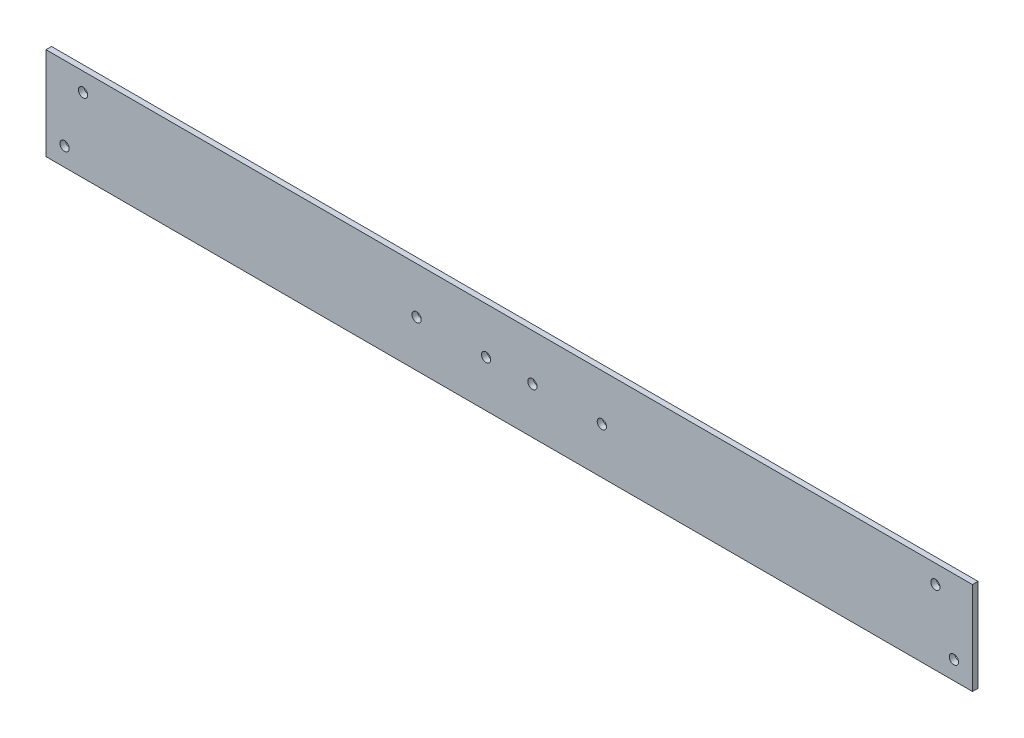
ISO-10303-21;
HEADER;
FILE_DESCRIPTION(('STEP AP214'),'2;1');
FILE_NAME('part.step','',(''),(''),'','','');
FILE_SCHEMA(('AUTOMOTIVE_DESIGN { 1 0 10303 214 1 1 1 1 }'));
ENDSEC;
DATA;
#1=APPLICATION_CONTEXT('core data for automotive mechanical design processes');
#2=APPLICATION_PROTOCOL_DEFINITION('international standard','automotive_design',2000,#1);
#3=PRODUCT_CONTEXT('',#1,'mechanical');
#4=PRODUCT('Part','Part','',(#3));
#5=PRODUCT_RELATED_PRODUCT_CATEGORY('part','',(#4));
#6=PRODUCT_DEFINITION_FORMATION('','',#4);
#7=PRODUCT_DEFINITION_CONTEXT('part definition',#1,'design');
#8=PRODUCT_DEFINITION('design','',#6,#7);
#9=PRODUCT_DEFINITION_SHAPE('','',#8);
#10=(LENGTH_UNIT() NAMED_UNIT(*) SI_UNIT(.MILLI.,.METRE.));
#11=(NAMED_UNIT(*) PLANE_ANGLE_UNIT() SI_UNIT($,.RADIAN.));
#12=(NAMED_UNIT(*) SI_UNIT($,.STERADIAN.) SOLID_ANGLE_UNIT());
#13=UNCERTAINTY_MEASURE_WITH_UNIT(LENGTH_MEASURE(1.E-05),#10,'distance_accuracy_value','');
#14=(GEOMETRIC_REPRESENTATION_CONTEXT(3) GLOBAL_UNCERTAINTY_ASSIGNED_CONTEXT((#13)) GLOBAL_UNIT_ASSIGNED_CONTEXT((#10,
#11,#12)) REPRESENTATION_CONTEXT('',''));
#15=CARTESIAN_POINT('',(0.,0.,0.));
#16=DIRECTION('',(0.,0.,1.));
#17=DIRECTION('',(1.,0.,0.));
#18=AXIS2_PLACEMENT_3D('',#15,#16,#17);
#19=CARTESIAN_POINT('',(0.,0.,3.));
#20=DIRECTION('',(0.,0.,-1.));
#21=DIRECTION('',(-1.,0.,0.));
#22=AXIS2_PLACEMENT_3D('',#19,#20,#21);
#23=PLANE('',#22);
#24=DIRECTION('',(0.,-1.,0.));
#25=VECTOR('',#24,1.);
#26=CARTESIAN_POINT('',(0.,0.,3.));
#27=LINE('',#26,#25);
#28=CARTESIAN_POINT('',(0.,50.,3.));
#29=VERTEX_POINT('',#28);
#30=CARTESIAN_POINT('',(0.,0.,3.));
#31=VERTEX_POINT('',#30);
#32=EDGE_CURVE('E97',#29,#31,#27,.T.);
#33=ORIENTED_EDGE('',*,*,#32,.T.);
#34=DIRECTION('',(1.,0.,0.));
#35=VECTOR('',#34,1.);
#36=CARTESIAN_POINT('',(0.,0.,3.));
#37=LINE('',#36,#35);
#38=CARTESIAN_POINT('',(500.,0.,3.));
#39=VERTEX_POINT('',#38);
#40=EDGE_CURVE('E93',#31,#39,#37,.T.);
#41=ORIENTED_EDGE('',*,*,#40,.T.);
#42=DIRECTION('',(0.,1.,0.));
#43=VECTOR('',#42,1.);
#44=CARTESIAN_POINT('',(500.,0.,3.));
#45=LINE('',#44,#43);
#46=CARTESIAN_POINT('',(500.,50.,3.));
#47=VERTEX_POINT('',#46);
#48=EDGE_CURVE('E96',#39,#47,#45,.T.);
#49=ORIENTED_EDGE('',*,*,#48,.T.);
#50=DIRECTION('',(-1.,0.,0.));
#51=VECTOR('',#50,1.);
#52=CARTESIAN_POINT('',(0.,50.,3.));
#53=LINE('',#52,#51);
#54=EDGE_CURVE('E64',#47,#29,#53,.T.);
#55=ORIENTED_EDGE('',*,*,#54,.T.);
#56=EDGE_LOOP('',(#33,#41,#49,#55));
#57=FACE_BOUND('',#56,.T.);
#58=CARTESIAN_POINT('',(20.,40.,3.));
#59=DIRECTION('',(0.,0.,1.));
#60=DIRECTION('',(1.,0.,0.));
#61=AXIS2_PLACEMENT_3D('',#58,#59,#60);
#62=CIRCLE('',#61,2.5);
#63=CARTESIAN_POINT('',(22.5,40.,3.));
#64=VERTEX_POINT('',#63);
#65=EDGE_CURVE('E119',#64,#64,#62,.T.);
#66=ORIENTED_EDGE('',*,*,#65,.F.);
#67=EDGE_LOOP('',(#66));
#68=FACE_BOUND('',#67,.T.);
#69=CARTESIAN_POINT('',(200.,25.,3.));
#70=DIRECTION('',(0.,0.,1.));
#71=DIRECTION('',(1.,0.,0.));
#72=AXIS2_PLACEMENT_3D('',#69,#70,#71);
#73=CIRCLE('',#72,2.5);
#74=CARTESIAN_POINT('',(202.5,25.,3.));
#75=VERTEX_POINT('',#74);
#76=EDGE_CURVE('E139',#75,#75,#73,.T.);
#77=ORIENTED_EDGE('',*,*,#76,.F.);
#78=EDGE_LOOP('',(#77));
#79=FACE_BOUND('',#78,.T.);
#80=CARTESIAN_POINT('',(237.5,25.,3.));
#81=DIRECTION('',(0.,0.,1.));
#82=DIRECTION('',(1.,0.,0.));
#83=AXIS2_PLACEMENT_3D('',#80,#81,#82);
#84=CIRCLE('',#83,2.5);
#85=CARTESIAN_POINT('',(240.,25.,3.));
#86=VERTEX_POINT('',#85);
#87=EDGE_CURVE('E149',#86,#86,#84,.T.);
#88=ORIENTED_EDGE('',*,*,#87,.F.);
#89=EDGE_LOOP('',(#88));
#90=FACE_BOUND('',#89,.T.);
#91=CARTESIAN_POINT('',(262.5,25.,3.));
#92=DIRECTION('',(0.,0.,1.));
#93=DIRECTION('',(-1.,0.,0.));
#94=AXIS2_PLACEMENT_3D('',#91,#92,#93);
#95=CIRCLE('',#94,2.49999999999997);
#96=CARTESIAN_POINT('',(260.,25.,3.));
#97=VERTEX_POINT('',#96);
#98=EDGE_CURVE('E157',#97,#97,#95,.T.);
#99=ORIENTED_EDGE('',*,*,#98,.F.);
#100=EDGE_LOOP('',(#99));
#101=FACE_BOUND('',#100,.T.);
#102=CARTESIAN_POINT('',(300.,25.,3.));
#103=DIRECTION('',(0.,0.,1.));
#104=DIRECTION('',(-1.,0.,0.));
#105=AXIS2_PLACEMENT_3D('',#102,#103,#104);
#106=CIRCLE('',#105,2.49999999999997);
#107=CARTESIAN_POINT('',(297.5,25.,3.));
#108=VERTEX_POINT('',#107);
#109=EDGE_CURVE('E163',#108,#108,#106,.T.);
#110=ORIENTED_EDGE('',*,*,#109,.F.);
#111=EDGE_LOOP('',(#110));
#112=FACE_BOUND('',#111,.T.);
#113=CARTESIAN_POINT('',(480.,40.,3.));
#114=DIRECTION('',(0.,0.,1.));
#115=DIRECTION('',(-1.,0.,0.));
#116=AXIS2_PLACEMENT_3D('',#113,#114,#115);
#117=CIRCLE('',#116,2.50000000000008);
#118=CARTESIAN_POINT('',(477.5,40.,3.));
#119=VERTEX_POINT('',#118);
#120=EDGE_CURVE('E175',#119,#119,#117,.T.);
#121=ORIENTED_EDGE('',*,*,#120,.F.);
#122=EDGE_LOOP('',(#121));
#123=FACE_BOUND('',#122,.T.);
#124=CARTESIAN_POINT('',(490.,10.,3.));
#125=DIRECTION('',(0.,0.,1.));
#126=DIRECTION('',(-1.,0.,0.));
#127=AXIS2_PLACEMENT_3D('',#124,#125,#126);
#128=CIRCLE('',#127,2.50000000000002);
#129=CARTESIAN_POINT('',(487.5,10.,3.));
#130=VERTEX_POINT('',#129);
#131=EDGE_CURVE('E179',#130,#130,#128,.T.);
#132=ORIENTED_EDGE('',*,*,#131,.F.);
#133=EDGE_LOOP('',(#132));
#134=FACE_BOUND('',#133,.T.);
#135=CARTESIAN_POINT('',(10.,10.,3.));
#136=DIRECTION('',(0.,0.,1.));
#137=DIRECTION('',(1.,0.,0.));
#138=AXIS2_PLACEMENT_3D('',#135,#136,#137);
#139=CIRCLE('',#138,2.50000000000003);
#140=CARTESIAN_POINT('',(12.5,10.,3.));
#141=VERTEX_POINT('',#140);
#142=EDGE_CURVE('E187',#141,#141,#139,.T.);
#143=ORIENTED_EDGE('',*,*,#142,.F.);
#144=EDGE_LOOP('',(#143));
#145=FACE_BOUND('',#144,.T.);
#146=ADVANCED_FACE('F44',(#57,#68,#79,#90,#101,#112,#123,#134,#145),#23,.F.);
#147=CARTESIAN_POINT('',(0.,0.,0.));
#148=DIRECTION('',(0.,0.,-1.));
#149=DIRECTION('',(-1.,0.,0.));
#150=AXIS2_PLACEMENT_3D('',#147,#148,#149);
#151=PLANE('',#150);
#152=CARTESIAN_POINT('',(490.,10.,0.));
#153=DIRECTION('',(0.,0.,1.));
#154=DIRECTION('',(-1.,0.,0.));
#155=AXIS2_PLACEMENT_3D('',#152,#153,#154);
#156=CIRCLE('',#155,2.50000000000002);
#157=CARTESIAN_POINT('',(487.5,10.,0.));
#158=VERTEX_POINT('',#157);
#159=EDGE_CURVE('E182',#158,#158,#156,.T.);
#160=ORIENTED_EDGE('',*,*,#159,.T.);
#161=EDGE_LOOP('',(#160));
#162=FACE_BOUND('',#161,.T.);
#163=CARTESIAN_POINT('',(300.,25.,0.));
#164=DIRECTION('',(0.,0.,1.));
#165=DIRECTION('',(-1.,0.,0.));
#166=AXIS2_PLACEMENT_3D('',#163,#164,#165);
#167=CIRCLE('',#166,2.49999999999997);
#168=CARTESIAN_POINT('',(297.5,25.,0.));
#169=VERTEX_POINT('',#168);
#170=EDGE_CURVE('E166',#169,#169,#167,.T.);
#171=ORIENTED_EDGE('',*,*,#170,.T.);
#172=EDGE_LOOP('',(#171));
#173=FACE_BOUND('',#172,.T.);
#174=CARTESIAN_POINT('',(237.5,25.,0.));
#175=DIRECTION('',(0.,0.,1.));
#176=DIRECTION('',(1.,0.,0.));
#177=AXIS2_PLACEMENT_3D('',#174,#175,#176);
#178=CIRCLE('',#177,2.5);
#179=CARTESIAN_POINT('',(240.,25.,0.));
#180=VERTEX_POINT('',#179);
#181=EDGE_CURVE('E152',#180,#180,#178,.T.);
#182=ORIENTED_EDGE('',*,*,#181,.T.);
#183=EDGE_LOOP('',(#182));
#184=FACE_BOUND('',#183,.T.);
#185=CARTESIAN_POINT('',(20.,40.,0.));
#186=DIRECTION('',(0.,0.,1.));
#187=DIRECTION('',(1.,0.,0.));
#188=AXIS2_PLACEMENT_3D('',#185,#186,#187);
#189=CIRCLE('',#188,2.5);
#190=CARTESIAN_POINT('',(22.5,40.,0.));
#191=VERTEX_POINT('',#190);
#192=EDGE_CURVE('E136',#191,#191,#189,.T.);
#193=ORIENTED_EDGE('',*,*,#192,.T.);
#194=EDGE_LOOP('',(#193));
#195=FACE_BOUND('',#194,.T.);
#196=DIRECTION('',(0.,-1.,0.));
#197=VECTOR('',#196,1.);
#198=CARTESIAN_POINT('',(0.,0.,0.));
#199=LINE('',#198,#197);
#200=CARTESIAN_POINT('',(0.,50.,0.));
#201=VERTEX_POINT('',#200);
#202=CARTESIAN_POINT('',(0.,0.,0.));
#203=VERTEX_POINT('',#202);
#204=EDGE_CURVE('E114',#201,#203,#199,.T.);
#205=ORIENTED_EDGE('',*,*,#204,.F.);
#206=DIRECTION('',(-1.,0.,0.));
#207=VECTOR('',#206,1.);
#208=CARTESIAN_POINT('',(0.,50.,0.));
#209=LINE('',#208,#207);
#210=CARTESIAN_POINT('',(500.,50.,0.));
#211=VERTEX_POINT('',#210);
#212=EDGE_CURVE('E86',#211,#201,#209,.T.);
#213=ORIENTED_EDGE('',*,*,#212,.F.);
#214=DIRECTION('',(0.,1.,0.));
#215=VECTOR('',#214,1.);
#216=CARTESIAN_POINT('',(500.,0.,0.));
#217=LINE('',#216,#215);
#218=CARTESIAN_POINT('',(500.,0.,0.));
#219=VERTEX_POINT('',#218);
#220=EDGE_CURVE('E79',#219,#211,#217,.T.);
#221=ORIENTED_EDGE('',*,*,#220,.F.);
#222=DIRECTION('',(1.,0.,0.));
#223=VECTOR('',#222,1.);
#224=CARTESIAN_POINT('',(0.,0.,0.));
#225=LINE('',#224,#223);
#226=EDGE_CURVE('E104',#203,#219,#225,.T.);
#227=ORIENTED_EDGE('',*,*,#226,.F.);
#228=EDGE_LOOP('',(#205,#213,#221,#227));
#229=FACE_BOUND('',#228,.T.);
#230=CARTESIAN_POINT('',(200.,25.,0.));
#231=DIRECTION('',(0.,0.,1.));
#232=DIRECTION('',(1.,0.,0.));
#233=AXIS2_PLACEMENT_3D('',#230,#231,#232);
#234=CIRCLE('',#233,2.5);
#235=CARTESIAN_POINT('',(202.5,25.,0.));
#236=VERTEX_POINT('',#235);
#237=EDGE_CURVE('E143',#236,#236,#234,.T.);
#238=ORIENTED_EDGE('',*,*,#237,.T.);
#239=EDGE_LOOP('',(#238));
#240=FACE_BOUND('',#239,.T.);
#241=CARTESIAN_POINT('',(262.5,25.,0.));
#242=DIRECTION('',(0.,0.,1.));
#243=DIRECTION('',(-1.,0.,0.));
#244=AXIS2_PLACEMENT_3D('',#241,#242,#243);
#245=CIRCLE('',#244,2.49999999999997);
#246=CARTESIAN_POINT('',(260.,25.,0.));
#247=VERTEX_POINT('',#246);
#248=EDGE_CURVE('E158',#247,#247,#245,.T.);
#249=ORIENTED_EDGE('',*,*,#248,.T.);
#250=EDGE_LOOP('',(#249));
#251=FACE_BOUND('',#250,.T.);
#252=CARTESIAN_POINT('',(480.,40.,0.));
#253=DIRECTION('',(0.,0.,1.));
#254=DIRECTION('',(-1.,0.,0.));
#255=AXIS2_PLACEMENT_3D('',#252,#253,#254);
#256=CIRCLE('',#255,2.50000000000008);
#257=CARTESIAN_POINT('',(477.5,40.,0.));
#258=VERTEX_POINT('',#257);
#259=EDGE_CURVE('E176',#258,#258,#256,.T.);
#260=ORIENTED_EDGE('',*,*,#259,.T.);
#261=EDGE_LOOP('',(#260));
#262=FACE_BOUND('',#261,.T.);
#263=CARTESIAN_POINT('',(10.,10.,0.));
#264=DIRECTION('',(0.,0.,1.));
#265=DIRECTION('',(1.,0.,0.));
#266=AXIS2_PLACEMENT_3D('',#263,#264,#265);
#267=CIRCLE('',#266,2.50000000000003);
#268=CARTESIAN_POINT('',(12.5,10.,0.));
#269=VERTEX_POINT('',#268);
#270=EDGE_CURVE('E195',#269,#269,#267,.T.);
#271=ORIENTED_EDGE('',*,*,#270,.T.);
#272=EDGE_LOOP('',(#271));
#273=FACE_BOUND('',#272,.T.);
#274=ADVANCED_FACE('F131',(#162,#173,#184,#195,#229,#240,#251,#262,#273),#151,.T.);
#275=CARTESIAN_POINT('',(0.,0.,3.));
#276=DIRECTION('',(1.,0.,0.));
#277=DIRECTION('',(0.,0.,-1.));
#278=AXIS2_PLACEMENT_3D('',#275,#276,#277);
#279=PLANE('',#278);
#280=ORIENTED_EDGE('',*,*,#204,.T.);
#281=DIRECTION('',(0.,0.,-1.));
#282=VECTOR('',#281,1.);
#283=CARTESIAN_POINT('',(0.,0.,3.));
#284=LINE('',#283,#282);
#285=EDGE_CURVE('E11',#31,#203,#284,.T.);
#286=ORIENTED_EDGE('',*,*,#285,.F.);
#287=ORIENTED_EDGE('',*,*,#32,.F.);
#288=DIRECTION('',(0.,0.,-1.));
#289=VECTOR('',#288,1.);
#290=CARTESIAN_POINT('',(0.,50.,3.));
#291=LINE('',#290,#289);
#292=EDGE_CURVE('E110',#29,#201,#291,.T.);
#293=ORIENTED_EDGE('',*,*,#292,.T.);
#294=EDGE_LOOP('',(#280,#286,#287,#293));
#295=FACE_BOUND('',#294,.T.);
#296=ADVANCED_FACE('F50',(#295),#279,.F.);
#297=CARTESIAN_POINT('',(0.,0.,3.));
#298=DIRECTION('',(0.,1.,0.));
#299=DIRECTION('',(0.,0.,1.));
#300=AXIS2_PLACEMENT_3D('',#297,#298,#299);
#301=PLANE('',#300);
#302=ORIENTED_EDGE('',*,*,#226,.T.);
#303=DIRECTION('',(0.,0.,-1.));
#304=VECTOR('',#303,1.);
#305=CARTESIAN_POINT('',(500.,0.,3.));
#306=LINE('',#305,#304);
#307=EDGE_CURVE('E54',#39,#219,#306,.T.);
#308=ORIENTED_EDGE('',*,*,#307,.F.);
#309=ORIENTED_EDGE('',*,*,#40,.F.);
#310=ORIENTED_EDGE('',*,*,#285,.T.);
#311=EDGE_LOOP('',(#302,#308,#309,#310));
#312=FACE_BOUND('',#311,.T.);
#313=ADVANCED_FACE('F105',(#312),#301,.F.);
#314=CARTESIAN_POINT('',(500.,0.,3.));
#315=DIRECTION('',(-1.,0.,0.));
#316=DIRECTION('',(0.,0.,1.));
#317=AXIS2_PLACEMENT_3D('',#314,#315,#316);
#318=PLANE('',#317);
#319=ORIENTED_EDGE('',*,*,#220,.T.);
#320=DIRECTION('',(0.,0.,-1.));
#321=VECTOR('',#320,1.);
#322=CARTESIAN_POINT('',(500.,50.,3.));
#323=LINE('',#322,#321);
#324=EDGE_CURVE('E103',#47,#211,#323,.T.);
#325=ORIENTED_EDGE('',*,*,#324,.F.);
#326=ORIENTED_EDGE('',*,*,#48,.F.);
#327=ORIENTED_EDGE('',*,*,#307,.T.);
#328=EDGE_LOOP('',(#319,#325,#326,#327));
#329=FACE_BOUND('',#328,.T.);
#330=ADVANCED_FACE('F106',(#329),#318,.F.);
#331=CARTESIAN_POINT('',(0.,50.,3.));
#332=DIRECTION('',(0.,-1.,0.));
#333=DIRECTION('',(0.,0.,-1.));
#334=AXIS2_PLACEMENT_3D('',#331,#332,#333);
#335=PLANE('',#334);
#336=ORIENTED_EDGE('',*,*,#212,.T.);
#337=ORIENTED_EDGE('',*,*,#292,.F.);
#338=ORIENTED_EDGE('',*,*,#54,.F.);
#339=ORIENTED_EDGE('',*,*,#324,.T.);
#340=EDGE_LOOP('',(#336,#337,#338,#339));
#341=FACE_BOUND('',#340,.T.);
#342=ADVANCED_FACE('F126',(#341),#335,.F.);
#343=CARTESIAN_POINT('',(20.,40.,3.));
#344=DIRECTION('',(0.,0.,-1.));
#345=DIRECTION('',(-1.,0.,0.));
#346=AXIS2_PLACEMENT_3D('',#343,#344,#345);
#347=CYLINDRICAL_SURFACE('',#346,2.5);
#348=ORIENTED_EDGE('',*,*,#65,.T.);
#349=EDGE_LOOP('',(#348));
#350=FACE_BOUND('',#349,.T.);
#351=ORIENTED_EDGE('',*,*,#192,.F.);
#352=EDGE_LOOP('',(#351));
#353=FACE_BOUND('',#352,.T.);
#354=ADVANCED_FACE('F213',(#350,#353),#347,.F.);
#355=CARTESIAN_POINT('',(200.,25.,3.));
#356=DIRECTION('',(0.,0.,-1.));
#357=DIRECTION('',(-1.,0.,0.));
#358=AXIS2_PLACEMENT_3D('',#355,#356,#357);
#359=CYLINDRICAL_SURFACE('',#358,2.5);
#360=ORIENTED_EDGE('',*,*,#76,.T.);
#361=EDGE_LOOP('',(#360));
#362=FACE_BOUND('',#361,.T.);
#363=ORIENTED_EDGE('',*,*,#237,.F.);
#364=EDGE_LOOP('',(#363));
#365=FACE_BOUND('',#364,.T.);
#366=ADVANCED_FACE('F258',(#362,#365),#359,.F.);
#367=CARTESIAN_POINT('',(237.5,25.,3.));
#368=DIRECTION('',(0.,0.,-1.));
#369=DIRECTION('',(-1.,0.,0.));
#370=AXIS2_PLACEMENT_3D('',#367,#368,#369);
#371=CYLINDRICAL_SURFACE('',#370,2.5);
#372=ORIENTED_EDGE('',*,*,#87,.T.);
#373=EDGE_LOOP('',(#372));
#374=FACE_BOUND('',#373,.T.);
#375=ORIENTED_EDGE('',*,*,#181,.F.);
#376=EDGE_LOOP('',(#375));
#377=FACE_BOUND('',#376,.T.);
#378=ADVANCED_FACE('F264',(#374,#377),#371,.F.);
#379=CARTESIAN_POINT('',(262.5,25.,3.));
#380=DIRECTION('',(0.,0.,-1.));
#381=DIRECTION('',(-1.,0.,0.));
#382=AXIS2_PLACEMENT_3D('',#379,#380,#381);
#383=CYLINDRICAL_SURFACE('',#382,2.49999999999997);
#384=ORIENTED_EDGE('',*,*,#98,.T.);
#385=EDGE_LOOP('',(#384));
#386=FACE_BOUND('',#385,.T.);
#387=ORIENTED_EDGE('',*,*,#248,.F.);
#388=EDGE_LOOP('',(#387));
#389=FACE_BOUND('',#388,.T.);
#390=ADVANCED_FACE('F275',(#386,#389),#383,.F.);
#391=CARTESIAN_POINT('',(300.,25.,3.));
#392=DIRECTION('',(0.,0.,-1.));
#393=DIRECTION('',(-1.,0.,0.));
#394=AXIS2_PLACEMENT_3D('',#391,#392,#393);
#395=CYLINDRICAL_SURFACE('',#394,2.49999999999997);
#396=ORIENTED_EDGE('',*,*,#109,.T.);
#397=EDGE_LOOP('',(#396));
#398=FACE_BOUND('',#397,.T.);
#399=ORIENTED_EDGE('',*,*,#170,.F.);
#400=EDGE_LOOP('',(#399));
#401=FACE_BOUND('',#400,.T.);
#402=ADVANCED_FACE('F282',(#398,#401),#395,.F.);
#403=CARTESIAN_POINT('',(480.,40.,3.));
#404=DIRECTION('',(0.,0.,-1.));
#405=DIRECTION('',(-1.,0.,0.));
#406=AXIS2_PLACEMENT_3D('',#403,#404,#405);
#407=CYLINDRICAL_SURFACE('',#406,2.50000000000008);
#408=ORIENTED_EDGE('',*,*,#120,.T.);
#409=EDGE_LOOP('',(#408));
#410=FACE_BOUND('',#409,.T.);
#411=ORIENTED_EDGE('',*,*,#259,.F.);
#412=EDGE_LOOP('',(#411));
#413=FACE_BOUND('',#412,.T.);
#414=ADVANCED_FACE('F290',(#410,#413),#407,.F.);
#415=CARTESIAN_POINT('',(490.,10.,3.));
#416=DIRECTION('',(0.,0.,-1.));
#417=DIRECTION('',(-1.,0.,0.));
#418=AXIS2_PLACEMENT_3D('',#415,#416,#417);
#419=CYLINDRICAL_SURFACE('',#418,2.50000000000002);
#420=ORIENTED_EDGE('',*,*,#131,.T.);
#421=EDGE_LOOP('',(#420));
#422=FACE_BOUND('',#421,.T.);
#423=ORIENTED_EDGE('',*,*,#159,.F.);
#424=EDGE_LOOP('',(#423));
#425=FACE_BOUND('',#424,.T.);
#426=ADVANCED_FACE('F298',(#422,#425),#419,.F.);
#427=CARTESIAN_POINT('',(10.,10.,3.));
#428=DIRECTION('',(0.,0.,-1.));
#429=DIRECTION('',(-1.,0.,0.));
#430=AXIS2_PLACEMENT_3D('',#427,#428,#429);
#431=CYLINDRICAL_SURFACE('',#430,2.50000000000003);
#432=ORIENTED_EDGE('',*,*,#142,.T.);
#433=EDGE_LOOP('',(#432));
#434=FACE_BOUND('',#433,.T.);
#435=ORIENTED_EDGE('',*,*,#270,.F.);
#436=EDGE_LOOP('',(#435));
#437=FACE_BOUND('',#436,.T.);
#438=ADVANCED_FACE('F200',(#434,#437),#431,.F.);
#439=CLOSED_SHELL('',(#146,#274,#296,#313,#330,#342,#354,#366,#378,#390,#402,#414,#426,#438));
#440=MANIFOLD_SOLID_BREP('B2',#439);
#441=ADVANCED_BREP_SHAPE_REPRESENTATION('',(#18,#440),#14);
#442=SHAPE_DEFINITION_REPRESENTATION(#9,#441);
ENDSEC;
END-ISO-10303-21;
